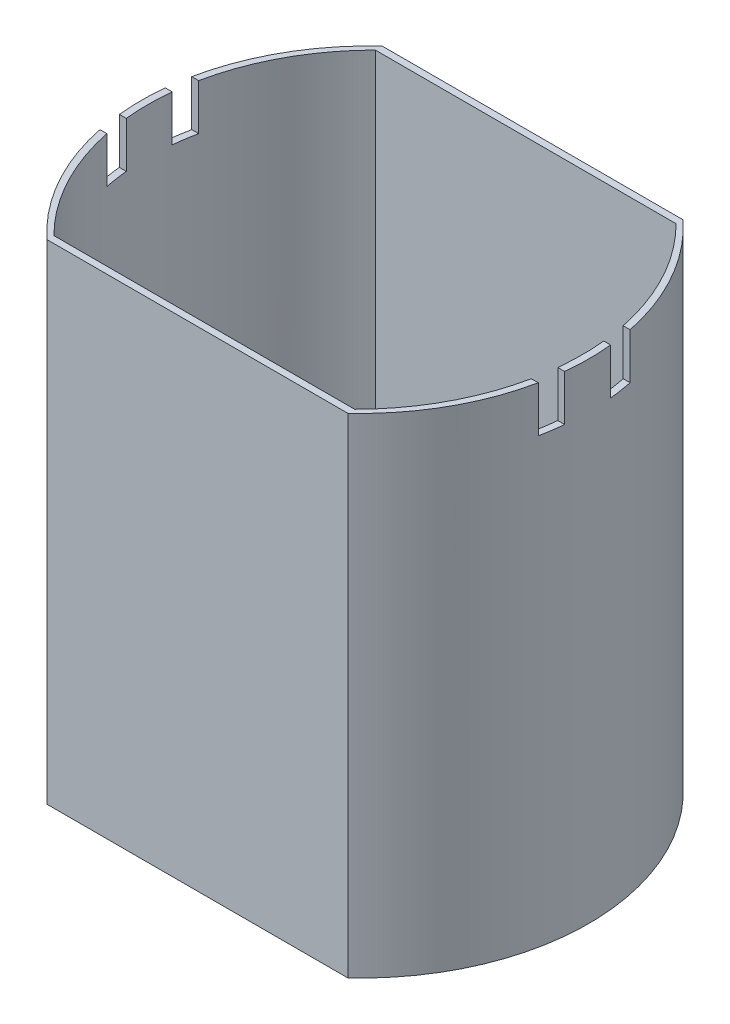
ISO-10303-21;
HEADER;
FILE_DESCRIPTION(('STEP AP214'),'2;1');
FILE_NAME('part.step','',(''),(''),'','','');
FILE_SCHEMA(('AUTOMOTIVE_DESIGN { 1 0 10303 214 1 1 1 1 }'));
ENDSEC;
DATA;
#1=APPLICATION_CONTEXT('core data for automotive mechanical design processes');
#2=APPLICATION_PROTOCOL_DEFINITION('international standard','automotive_design',2000,#1);
#3=PRODUCT_CONTEXT('',#1,'mechanical');
#4=PRODUCT('Part','Part','',(#3));
#5=PRODUCT_RELATED_PRODUCT_CATEGORY('part','',(#4));
#6=PRODUCT_DEFINITION_FORMATION('','',#4);
#7=PRODUCT_DEFINITION_CONTEXT('part definition',#1,'design');
#8=PRODUCT_DEFINITION('design','',#6,#7);
#9=PRODUCT_DEFINITION_SHAPE('','',#8);
#10=(LENGTH_UNIT() NAMED_UNIT(*) SI_UNIT(.MILLI.,.METRE.));
#11=(NAMED_UNIT(*) PLANE_ANGLE_UNIT() SI_UNIT($,.RADIAN.));
#12=(NAMED_UNIT(*) SI_UNIT($,.STERADIAN.) SOLID_ANGLE_UNIT());
#13=UNCERTAINTY_MEASURE_WITH_UNIT(LENGTH_MEASURE(1.E-05),#10,'distance_accuracy_value','');
#14=(GEOMETRIC_REPRESENTATION_CONTEXT(3) GLOBAL_UNCERTAINTY_ASSIGNED_CONTEXT((#13)) GLOBAL_UNIT_ASSIGNED_CONTEXT((#10,
#11,#12)) REPRESENTATION_CONTEXT('',''));
#15=CARTESIAN_POINT('',(0.,0.,0.));
#16=DIRECTION('',(0.,0.,1.));
#17=DIRECTION('',(1.,0.,0.));
#18=AXIS2_PLACEMENT_3D('',#15,#16,#17);
#19=CARTESIAN_POINT('',(-0.176562499999976,21.,0.));
#20=DIRECTION('',(0.,-1.,0.));
#21=DIRECTION('',(0.,0.,-1.));
#22=AXIS2_PLACEMENT_3D('',#19,#20,#21);
#23=PLANE('',#22);
#24=CARTESIAN_POINT('',(0.450000000000025,21.,0.));
#25=DIRECTION('',(0.,1.,0.));
#26=DIRECTION('',(0.,0.,1.));
#27=AXIS2_PLACEMENT_3D('',#24,#25,#26);
#28=CIRCLE('',#27,9.89949493661168);
#29=CARTESIAN_POINT('',(-9.3988578017961,21.,-0.999999999999998));
#30=VERTEX_POINT('',#29);
#31=CARTESIAN_POINT('',(-9.3988578017961,21.,1.));
#32=VERTEX_POINT('',#31);
#33=EDGE_CURVE('E233',#30,#32,#28,.T.);
#34=ORIENTED_EDGE('',*,*,#33,.F.);
#35=DIRECTION('',(1.,0.,0.));
#36=VECTOR('',#35,1.);
#37=CARTESIAN_POINT('',(-7.63118837493959,21.,-0.999999999999998));
#38=LINE('',#37,#36);
#39=CARTESIAN_POINT('',(-9.69950164855667,21.,-0.999999999999998));
#40=VERTEX_POINT('',#39);
#41=EDGE_CURVE('E347',#40,#30,#38,.T.);
#42=ORIENTED_EDGE('',*,*,#41,.F.);
#43=CARTESIAN_POINT('',(0.176562499999976,21.,0.));
#44=DIRECTION('',(0.,1.,0.));
#45=DIRECTION('',(0.,0.,1.));
#46=AXIS2_PLACEMENT_3D('',#43,#44,#45);
#47=CIRCLE('',#46,9.92656249999998);
#48=CARTESIAN_POINT('',(-9.69950164855667,21.,1.));
#49=VERTEX_POINT('',#48);
#50=EDGE_CURVE('E373',#40,#49,#47,.T.);
#51=ORIENTED_EDGE('',*,*,#50,.T.);
#52=DIRECTION('',(-1.,0.,0.));
#53=VECTOR('',#52,1.);
#54=CARTESIAN_POINT('',(-14.6311157832539,21.,1.));
#55=LINE('',#54,#53);
#56=EDGE_CURVE('E350',#32,#49,#55,.T.);
#57=ORIENTED_EDGE('',*,*,#56,.F.);
#58=EDGE_LOOP('',(#34,#42,#51,#57));
#59=FACE_BOUND('',#58,.T.);
#60=ADVANCED_FACE('F39',(#59),#23,.F.);
#61=CARTESIAN_POINT('',(-9.24535971483265,21.,2.));
#62=VERTEX_POINT('',#61);
#63=CARTESIAN_POINT('',(-6.55,21.,7.));
#64=VERTEX_POINT('',#63);
#65=EDGE_CURVE('E235',#62,#64,#28,.T.);
#66=ORIENTED_EDGE('',*,*,#65,.F.);
#67=DIRECTION('',(1.,0.,0.));
#68=VECTOR('',#67,1.);
#69=CARTESIAN_POINT('',(-7.53887561233951,21.,2.));
#70=LINE('',#69,#68);
#71=CARTESIAN_POINT('',(-9.54643308091057,21.,2.));
#72=VERTEX_POINT('',#71);
#73=EDGE_CURVE('E223',#72,#62,#70,.T.);
#74=ORIENTED_EDGE('',*,*,#73,.F.);
#75=CARTESIAN_POINT('',(-6.54999999999999,21.,7.3));
#76=VERTEX_POINT('',#75);
#77=EDGE_CURVE('E439',#72,#76,#47,.T.);
#78=ORIENTED_EDGE('',*,*,#77,.T.);
#79=DIRECTION('',(1.,0.,0.));
#80=VECTOR('',#79,1.);
#81=CARTESIAN_POINT('',(-6.54999999999999,21.,7.3));
#82=LINE('',#81,#80);
#83=CARTESIAN_POINT('',(6.54999999999999,21.,7.3));
#84=VERTEX_POINT('',#83);
#85=EDGE_CURVE('E430',#76,#84,#82,.T.);
#86=ORIENTED_EDGE('',*,*,#85,.T.);
#87=CARTESIAN_POINT('',(-0.176562499999976,21.,0.));
#88=DIRECTION('',(0.,1.,0.));
#89=DIRECTION('',(0.,0.,-1.));
#90=AXIS2_PLACEMENT_3D('',#87,#88,#89);
#91=CIRCLE('',#90,9.92656249999998);
#92=CARTESIAN_POINT('',(9.54643308091056,21.,2.));
#93=VERTEX_POINT('',#92);
#94=EDGE_CURVE('E425',#84,#93,#91,.T.);
#95=ORIENTED_EDGE('',*,*,#94,.T.);
#96=DIRECTION('',(1.,0.,0.));
#97=VECTOR('',#96,1.);
#98=CARTESIAN_POINT('',(7.53887561233951,21.,2.));
#99=LINE('',#98,#97);
#100=CARTESIAN_POINT('',(9.24535971483265,21.,2.));
#101=VERTEX_POINT('',#100);
#102=EDGE_CURVE('E324',#101,#93,#99,.T.);
#103=ORIENTED_EDGE('',*,*,#102,.F.);
#104=CARTESIAN_POINT('',(-0.450000000000025,21.,0.));
#105=DIRECTION('',(0.,1.,0.));
#106=DIRECTION('',(0.,0.,-1.));
#107=AXIS2_PLACEMENT_3D('',#104,#105,#106);
#108=CIRCLE('',#107,9.89949493661168);
#109=CARTESIAN_POINT('',(6.55,21.,7.));
#110=VERTEX_POINT('',#109);
#111=EDGE_CURVE('E249',#110,#101,#108,.T.);
#112=ORIENTED_EDGE('',*,*,#111,.F.);
#113=DIRECTION('',(1.,0.,0.));
#114=VECTOR('',#113,1.);
#115=CARTESIAN_POINT('',(-6.55,21.,7.));
#116=LINE('',#115,#114);
#117=EDGE_CURVE('E232',#64,#110,#116,.T.);
#118=ORIENTED_EDGE('',*,*,#117,.F.);
#119=EDGE_LOOP('',(#66,#74,#78,#86,#95,#103,#112,#118));
#120=FACE_BOUND('',#119,.T.);
#121=ADVANCED_FACE('F427',(#120),#23,.F.);
#122=CARTESIAN_POINT('',(-6.55,21.,-7.30000000000001));
#123=VERTEX_POINT('',#122);
#124=CARTESIAN_POINT('',(-9.54643308091057,21.,-2.));
#125=VERTEX_POINT('',#124);
#126=EDGE_CURVE('E221',#123,#125,#47,.T.);
#127=ORIENTED_EDGE('',*,*,#126,.T.);
#128=DIRECTION('',(-1.,0.,0.));
#129=VECTOR('',#128,1.);
#130=CARTESIAN_POINT('',(-15.3845657466614,21.,-2.));
#131=LINE('',#130,#129);
#132=CARTESIAN_POINT('',(-9.24535971483265,21.,-2.));
#133=VERTEX_POINT('',#132);
#134=EDGE_CURVE('E203',#133,#125,#131,.T.);
#135=ORIENTED_EDGE('',*,*,#134,.F.);
#136=CARTESIAN_POINT('',(-6.55,21.,-7.));
#137=VERTEX_POINT('',#136);
#138=EDGE_CURVE('E219',#137,#133,#28,.T.);
#139=ORIENTED_EDGE('',*,*,#138,.F.);
#140=DIRECTION('',(-1.,0.,0.));
#141=VECTOR('',#140,1.);
#142=CARTESIAN_POINT('',(-6.55,21.,-7.));
#143=LINE('',#142,#141);
#144=CARTESIAN_POINT('',(6.55,21.,-7.));
#145=VERTEX_POINT('',#144);
#146=EDGE_CURVE('E243',#145,#137,#143,.T.);
#147=ORIENTED_EDGE('',*,*,#146,.F.);
#148=CARTESIAN_POINT('',(9.24535971483265,21.,-2.));
#149=VERTEX_POINT('',#148);
#150=EDGE_CURVE('E256',#149,#145,#108,.T.);
#151=ORIENTED_EDGE('',*,*,#150,.F.);
#152=DIRECTION('',(-1.,0.,0.));
#153=VECTOR('',#152,1.);
#154=CARTESIAN_POINT('',(15.3845657466614,21.,-2.));
#155=LINE('',#154,#153);
#156=CARTESIAN_POINT('',(9.54643308091057,21.,-2.));
#157=VERTEX_POINT('',#156);
#158=EDGE_CURVE('E333',#157,#149,#155,.T.);
#159=ORIENTED_EDGE('',*,*,#158,.F.);
#160=CARTESIAN_POINT('',(6.55,21.,-7.3));
#161=VERTEX_POINT('',#160);
#162=EDGE_CURVE('E436',#157,#161,#91,.T.);
#163=ORIENTED_EDGE('',*,*,#162,.T.);
#164=DIRECTION('',(-1.,0.,0.));
#165=VECTOR('',#164,1.);
#166=CARTESIAN_POINT('',(-6.55,21.,-7.30000000000001));
#167=LINE('',#166,#165);
#168=EDGE_CURVE('E433',#161,#123,#167,.T.);
#169=ORIENTED_EDGE('',*,*,#168,.T.);
#170=EDGE_LOOP('',(#127,#135,#139,#147,#151,#159,#163,#169));
#171=FACE_BOUND('',#170,.T.);
#172=ADVANCED_FACE('F217',(#171),#23,.F.);
#173=CARTESIAN_POINT('',(9.3988578017961,21.,1.));
#174=VERTEX_POINT('',#173);
#175=CARTESIAN_POINT('',(9.3988578017961,21.,-0.999999999999998));
#176=VERTEX_POINT('',#175);
#177=EDGE_CURVE('E254',#174,#176,#108,.T.);
#178=ORIENTED_EDGE('',*,*,#177,.F.);
#179=DIRECTION('',(-1.,0.,0.));
#180=VECTOR('',#179,1.);
#181=CARTESIAN_POINT('',(14.6311157832539,21.,1.));
#182=LINE('',#181,#180);
#183=CARTESIAN_POINT('',(9.69950164855667,21.,1.));
#184=VERTEX_POINT('',#183);
#185=EDGE_CURVE('E327',#184,#174,#182,.T.);
#186=ORIENTED_EDGE('',*,*,#185,.F.);
#187=CARTESIAN_POINT('',(9.69950164855667,21.,-0.999999999999998));
#188=VERTEX_POINT('',#187);
#189=EDGE_CURVE('E434',#184,#188,#91,.T.);
#190=ORIENTED_EDGE('',*,*,#189,.T.);
#191=DIRECTION('',(1.,0.,0.));
#192=VECTOR('',#191,1.);
#193=CARTESIAN_POINT('',(7.63118837493959,21.,-0.999999999999998));
#194=LINE('',#193,#192);
#195=EDGE_CURVE('E330',#176,#188,#194,.T.);
#196=ORIENTED_EDGE('',*,*,#195,.F.);
#197=EDGE_LOOP('',(#178,#186,#190,#196));
#198=FACE_BOUND('',#197,.T.);
#199=ADVANCED_FACE('F525',(#198),#23,.F.);
#200=CARTESIAN_POINT('',(-0.176562499999976,21.,0.));
#201=DIRECTION('',(0.,-1.,0.));
#202=DIRECTION('',(0.,0.,-1.));
#203=AXIS2_PLACEMENT_3D('',#200,#201,#202);
#204=CYLINDRICAL_SURFACE('',#203,9.92656249999998);
#205=CARTESIAN_POINT('',(-0.176562499999976,19.,0.));
#206=DIRECTION('',(0.,1.,0.));
#207=DIRECTION('',(0.,0.,1.));
#208=AXIS2_PLACEMENT_3D('',#205,#206,#207);
#209=CIRCLE('',#208,9.92656249999998);
#210=CARTESIAN_POINT('',(9.54643308091056,19.,2.));
#211=VERTEX_POINT('',#210);
#212=CARTESIAN_POINT('',(9.69950164855667,19.,1.));
#213=VERTEX_POINT('',#212);
#214=EDGE_CURVE('E299',#211,#213,#209,.T.);
#215=ORIENTED_EDGE('',*,*,#214,.F.);
#216=DIRECTION('',(0.,-1.,0.));
#217=VECTOR('',#216,1.);
#218=CARTESIAN_POINT('',(9.54643308091056,21.,2.));
#219=LINE('',#218,#217);
#220=EDGE_CURVE('E287',#211,#93,#219,.F.);
#221=ORIENTED_EDGE('',*,*,#220,.T.);
#222=ORIENTED_EDGE('',*,*,#94,.F.);
#223=DIRECTION('',(0.,-1.,0.));
#224=VECTOR('',#223,1.);
#225=CARTESIAN_POINT('',(6.54999999999999,21.,7.3));
#226=LINE('',#225,#224);
#227=CARTESIAN_POINT('',(6.54999999999999,-0.3,7.3));
#228=VERTEX_POINT('',#227);
#229=EDGE_CURVE('E490',#84,#228,#226,.T.);
#230=ORIENTED_EDGE('',*,*,#229,.T.);
#231=CARTESIAN_POINT('',(-0.176562499999981,-0.3,0.));
#232=DIRECTION('',(0.,1.,0.));
#233=DIRECTION('',(0.,0.,-1.));
#234=AXIS2_PLACEMENT_3D('',#231,#232,#233);
#235=CIRCLE('',#234,9.92656249999999);
#236=CARTESIAN_POINT('',(6.55,-0.3,-7.3));
#237=VERTEX_POINT('',#236);
#238=EDGE_CURVE('E271',#228,#237,#235,.T.);
#239=ORIENTED_EDGE('',*,*,#238,.T.);
#240=DIRECTION('',(0.,-1.,0.));
#241=VECTOR('',#240,1.);
#242=CARTESIAN_POINT('',(6.55,21.,-7.3));
#243=LINE('',#242,#241);
#244=EDGE_CURVE('E499',#161,#237,#243,.T.);
#245=ORIENTED_EDGE('',*,*,#244,.F.);
#246=ORIENTED_EDGE('',*,*,#162,.F.);
#247=DIRECTION('',(0.,-1.,0.));
#248=VECTOR('',#247,1.);
#249=CARTESIAN_POINT('',(9.54643308091056,21.,-2.));
#250=LINE('',#249,#248);
#251=CARTESIAN_POINT('',(9.54643308091057,19.,-2.));
#252=VERTEX_POINT('',#251);
#253=EDGE_CURVE('E280',#157,#252,#250,.T.);
#254=ORIENTED_EDGE('',*,*,#253,.T.);
#255=CARTESIAN_POINT('',(9.69950164855667,19.,-0.999999999999998));
#256=VERTEX_POINT('',#255);
#257=EDGE_CURVE('E300',#256,#252,#209,.T.);
#258=ORIENTED_EDGE('',*,*,#257,.F.);
#259=DIRECTION('',(0.,-1.,0.));
#260=VECTOR('',#259,1.);
#261=CARTESIAN_POINT('',(9.69950164855667,21.,-0.999999999999998));
#262=LINE('',#261,#260);
#263=EDGE_CURVE('E295',#256,#188,#262,.F.);
#264=ORIENTED_EDGE('',*,*,#263,.T.);
#265=ORIENTED_EDGE('',*,*,#189,.F.);
#266=DIRECTION('',(0.,-1.,0.));
#267=VECTOR('',#266,1.);
#268=CARTESIAN_POINT('',(9.69950164855667,21.,1.));
#269=LINE('',#268,#267);
#270=EDGE_CURVE('E291',#184,#213,#269,.T.);
#271=ORIENTED_EDGE('',*,*,#270,.T.);
#272=EDGE_LOOP('',(#215,#221,#222,#230,#239,#245,#246,#254,#258,#264,#265,#271));
#273=FACE_BOUND('',#272,.T.);
#274=ADVANCED_FACE('F41',(#273),#204,.T.);
#275=CARTESIAN_POINT('',(-6.55,21.,-7.30000000000001));
#276=DIRECTION('',(0.,0.,1.));
#277=DIRECTION('',(1.,0.,0.));
#278=AXIS2_PLACEMENT_3D('',#275,#276,#277);
#279=PLANE('',#278);
#280=ORIENTED_EDGE('',*,*,#244,.T.);
#281=DIRECTION('',(-1.,0.,0.));
#282=VECTOR('',#281,1.);
#283=CARTESIAN_POINT('',(-6.55,-0.3,-7.30000000000001));
#284=LINE('',#283,#282);
#285=CARTESIAN_POINT('',(-6.55,-0.3,-7.30000000000001));
#286=VERTEX_POINT('',#285);
#287=EDGE_CURVE('E267',#237,#286,#284,.T.);
#288=ORIENTED_EDGE('',*,*,#287,.T.);
#289=DIRECTION('',(0.,-1.,0.));
#290=VECTOR('',#289,1.);
#291=CARTESIAN_POINT('',(-6.55,21.,-7.30000000000001));
#292=LINE('',#291,#290);
#293=EDGE_CURVE('E496',#123,#286,#292,.T.);
#294=ORIENTED_EDGE('',*,*,#293,.F.);
#295=ORIENTED_EDGE('',*,*,#168,.F.);
#296=EDGE_LOOP('',(#280,#288,#294,#295));
#297=FACE_BOUND('',#296,.T.);
#298=ADVANCED_FACE('F505',(#297),#279,.F.);
#299=CARTESIAN_POINT('',(0.176562499999976,21.,0.));
#300=DIRECTION('',(0.,-1.,0.));
#301=DIRECTION('',(0.,0.,-1.));
#302=AXIS2_PLACEMENT_3D('',#299,#300,#301);
#303=CYLINDRICAL_SURFACE('',#302,9.92656249999998);
#304=CARTESIAN_POINT('',(0.176562499999976,19.,0.));
#305=DIRECTION('',(0.,-1.,0.));
#306=DIRECTION('',(0.,0.,-1.));
#307=AXIS2_PLACEMENT_3D('',#304,#305,#306);
#308=CIRCLE('',#307,9.92656249999998);
#309=CARTESIAN_POINT('',(-9.54643308091057,19.,2.));
#310=VERTEX_POINT('',#309);
#311=CARTESIAN_POINT('',(-9.69950164855667,19.,1.));
#312=VERTEX_POINT('',#311);
#313=EDGE_CURVE('E318',#310,#312,#308,.T.);
#314=ORIENTED_EDGE('',*,*,#313,.T.);
#315=DIRECTION('',(0.,-1.,0.));
#316=VECTOR('',#315,1.);
#317=CARTESIAN_POINT('',(-9.69950164855667,21.,1.));
#318=LINE('',#317,#316);
#319=EDGE_CURVE('E307',#312,#49,#318,.F.);
#320=ORIENTED_EDGE('',*,*,#319,.T.);
#321=ORIENTED_EDGE('',*,*,#50,.F.);
#322=DIRECTION('',(0.,-1.,0.));
#323=VECTOR('',#322,1.);
#324=CARTESIAN_POINT('',(-9.69950164855667,21.,-0.999999999999998));
#325=LINE('',#324,#323);
#326=CARTESIAN_POINT('',(-9.69950164855667,19.,-0.999999999999998));
#327=VERTEX_POINT('',#326);
#328=EDGE_CURVE('E303',#40,#327,#325,.T.);
#329=ORIENTED_EDGE('',*,*,#328,.T.);
#330=CARTESIAN_POINT('',(-9.54643308091057,19.,-2.));
#331=VERTEX_POINT('',#330);
#332=EDGE_CURVE('E319',#327,#331,#308,.T.);
#333=ORIENTED_EDGE('',*,*,#332,.T.);
#334=DIRECTION('',(0.,-1.,0.));
#335=VECTOR('',#334,1.);
#336=CARTESIAN_POINT('',(-9.54643308091057,21.,-2.));
#337=LINE('',#336,#335);
#338=EDGE_CURVE('E315',#331,#125,#337,.F.);
#339=ORIENTED_EDGE('',*,*,#338,.T.);
#340=ORIENTED_EDGE('',*,*,#126,.F.);
#341=ORIENTED_EDGE('',*,*,#293,.T.);
#342=CARTESIAN_POINT('',(0.176562499999983,-0.3,0.));
#343=DIRECTION('',(0.,1.,0.));
#344=DIRECTION('',(0.,0.,1.));
#345=AXIS2_PLACEMENT_3D('',#342,#343,#344);
#346=CIRCLE('',#345,9.92656249999998);
#347=CARTESIAN_POINT('',(-6.54999999999999,-0.3,7.29999999999998));
#348=VERTEX_POINT('',#347);
#349=EDGE_CURVE('E263',#286,#348,#346,.T.);
#350=ORIENTED_EDGE('',*,*,#349,.T.);
#351=DIRECTION('',(0.,-1.,0.));
#352=VECTOR('',#351,1.);
#353=CARTESIAN_POINT('',(-6.54999999999999,21.,7.3));
#354=LINE('',#353,#352);
#355=EDGE_CURVE('E483',#76,#348,#354,.T.);
#356=ORIENTED_EDGE('',*,*,#355,.F.);
#357=ORIENTED_EDGE('',*,*,#77,.F.);
#358=DIRECTION('',(0.,-1.,0.));
#359=VECTOR('',#358,1.);
#360=CARTESIAN_POINT('',(-9.54643308091056,21.,2.));
#361=LINE('',#360,#359);
#362=EDGE_CURVE('E311',#72,#310,#361,.T.);
#363=ORIENTED_EDGE('',*,*,#362,.T.);
#364=EDGE_LOOP('',(#314,#320,#321,#329,#333,#339,#340,#341,#350,#356,#357,#363));
#365=FACE_BOUND('',#364,.T.);
#366=ADVANCED_FACE('F370',(#365),#303,.T.);
#367=CARTESIAN_POINT('',(-6.54999999999999,21.,7.3));
#368=DIRECTION('',(0.,0.,-1.));
#369=DIRECTION('',(-1.,0.,0.));
#370=AXIS2_PLACEMENT_3D('',#367,#368,#369);
#371=PLANE('',#370);
#372=ORIENTED_EDGE('',*,*,#355,.T.);
#373=DIRECTION('',(1.,0.,0.));
#374=VECTOR('',#373,1.);
#375=CARTESIAN_POINT('',(-6.54999999999999,-0.3,7.29999999999999));
#376=LINE('',#375,#374);
#377=EDGE_CURVE('E258',#348,#228,#376,.T.);
#378=ORIENTED_EDGE('',*,*,#377,.T.);
#379=ORIENTED_EDGE('',*,*,#229,.F.);
#380=ORIENTED_EDGE('',*,*,#85,.F.);
#381=EDGE_LOOP('',(#372,#378,#379,#380));
#382=FACE_BOUND('',#381,.T.);
#383=ADVANCED_FACE('F513',(#382),#371,.F.);
#384=CARTESIAN_POINT('',(-0.450000000000025,21.,0.));
#385=DIRECTION('',(0.,-1.,0.));
#386=DIRECTION('',(0.,0.,-1.));
#387=AXIS2_PLACEMENT_3D('',#384,#385,#386);
#388=CYLINDRICAL_SURFACE('',#387,9.89949493661168);
#389=DIRECTION('',(0.,-1.,0.));
#390=VECTOR('',#389,1.);
#391=CARTESIAN_POINT('',(9.24535971483265,21.,2.));
#392=LINE('',#391,#390);
#393=CARTESIAN_POINT('',(9.24535971483265,19.,2.));
#394=VERTEX_POINT('',#393);
#395=EDGE_CURVE('E11',#394,#101,#392,.F.);
#396=ORIENTED_EDGE('',*,*,#395,.F.);
#397=CARTESIAN_POINT('',(-0.450000000000025,19.,0.));
#398=DIRECTION('',(0.,1.,0.));
#399=DIRECTION('',(0.,0.,1.));
#400=AXIS2_PLACEMENT_3D('',#397,#398,#399);
#401=CIRCLE('',#400,9.89949493661168);
#402=CARTESIAN_POINT('',(9.3988578017961,19.,1.));
#403=VERTEX_POINT('',#402);
#404=EDGE_CURVE('E401',#394,#403,#401,.T.);
#405=ORIENTED_EDGE('',*,*,#404,.T.);
#406=DIRECTION('',(0.,-1.,0.));
#407=VECTOR('',#406,1.);
#408=CARTESIAN_POINT('',(9.39885780179609,21.,1.));
#409=LINE('',#408,#407);
#410=EDGE_CURVE('E48',#174,#403,#409,.T.);
#411=ORIENTED_EDGE('',*,*,#410,.F.);
#412=ORIENTED_EDGE('',*,*,#177,.T.);
#413=DIRECTION('',(0.,-1.,0.));
#414=VECTOR('',#413,1.);
#415=CARTESIAN_POINT('',(9.39885780179609,21.,-0.999999999999998));
#416=LINE('',#415,#414);
#417=CARTESIAN_POINT('',(9.3988578017961,19.,-0.999999999999998));
#418=VERTEX_POINT('',#417);
#419=EDGE_CURVE('E400',#418,#176,#416,.F.);
#420=ORIENTED_EDGE('',*,*,#419,.F.);
#421=CARTESIAN_POINT('',(9.24535971483265,19.,-2.));
#422=VERTEX_POINT('',#421);
#423=EDGE_CURVE('E396',#418,#422,#401,.T.);
#424=ORIENTED_EDGE('',*,*,#423,.T.);
#425=DIRECTION('',(0.,-1.,0.));
#426=VECTOR('',#425,1.);
#427=CARTESIAN_POINT('',(9.24535971483265,21.,-2.));
#428=LINE('',#427,#426);
#429=EDGE_CURVE('E404',#149,#422,#428,.T.);
#430=ORIENTED_EDGE('',*,*,#429,.F.);
#431=ORIENTED_EDGE('',*,*,#150,.T.);
#432=DIRECTION('',(0.,-1.,0.));
#433=VECTOR('',#432,1.);
#434=CARTESIAN_POINT('',(6.55,21.,-7.));
#435=LINE('',#434,#433);
#436=CARTESIAN_POINT('',(6.55,0.,-7.));
#437=VERTEX_POINT('',#436);
#438=EDGE_CURVE('E444',#145,#437,#435,.T.);
#439=ORIENTED_EDGE('',*,*,#438,.T.);
#440=CARTESIAN_POINT('',(-0.450000000000025,0.,0.));
#441=DIRECTION('',(0.,1.,0.));
#442=DIRECTION('',(0.,0.,-1.));
#443=AXIS2_PLACEMENT_3D('',#440,#441,#442);
#444=CIRCLE('',#443,9.89949493661168);
#445=CARTESIAN_POINT('',(6.55,0.,7.));
#446=VERTEX_POINT('',#445);
#447=EDGE_CURVE('E262',#446,#437,#444,.T.);
#448=ORIENTED_EDGE('',*,*,#447,.F.);
#449=DIRECTION('',(0.,-1.,0.));
#450=VECTOR('',#449,1.);
#451=CARTESIAN_POINT('',(6.55,21.,7.));
#452=LINE('',#451,#450);
#453=EDGE_CURVE('E238',#110,#446,#452,.T.);
#454=ORIENTED_EDGE('',*,*,#453,.F.);
#455=ORIENTED_EDGE('',*,*,#111,.T.);
#456=EDGE_LOOP('',(#396,#405,#411,#412,#420,#424,#430,#431,#439,#448,#454,#455));
#457=FACE_BOUND('',#456,.T.);
#458=ADVANCED_FACE('F413',(#457),#388,.F.);
#459=CARTESIAN_POINT('',(-6.55,21.,-7.));
#460=DIRECTION('',(0.,0.,1.));
#461=DIRECTION('',(1.,0.,0.));
#462=AXIS2_PLACEMENT_3D('',#459,#460,#461);
#463=PLANE('',#462);
#464=DIRECTION('',(-1.,0.,0.));
#465=VECTOR('',#464,1.);
#466=CARTESIAN_POINT('',(-6.55,0.,-7.));
#467=LINE('',#466,#465);
#468=CARTESIAN_POINT('',(-6.55,0.,-7.));
#469=VERTEX_POINT('',#468);
#470=EDGE_CURVE('E468',#437,#469,#467,.T.);
#471=ORIENTED_EDGE('',*,*,#470,.F.);
#472=ORIENTED_EDGE('',*,*,#438,.F.);
#473=ORIENTED_EDGE('',*,*,#146,.T.);
#474=DIRECTION('',(0.,-1.,0.));
#475=VECTOR('',#474,1.);
#476=CARTESIAN_POINT('',(-6.55,21.,-7.));
#477=LINE('',#476,#475);
#478=EDGE_CURVE('E230',#137,#469,#477,.T.);
#479=ORIENTED_EDGE('',*,*,#478,.T.);
#480=EDGE_LOOP('',(#471,#472,#473,#479));
#481=FACE_BOUND('',#480,.T.);
#482=ADVANCED_FACE('F520',(#481),#463,.T.);
#483=CARTESIAN_POINT('',(0.450000000000025,21.,0.));
#484=DIRECTION('',(0.,-1.,0.));
#485=DIRECTION('',(0.,0.,-1.));
#486=AXIS2_PLACEMENT_3D('',#483,#484,#485);
#487=CYLINDRICAL_SURFACE('',#486,9.89949493661168);
#488=DIRECTION('',(0.,-1.,0.));
#489=VECTOR('',#488,1.);
#490=CARTESIAN_POINT('',(-9.39885780179609,21.,1.));
#491=LINE('',#490,#489);
#492=CARTESIAN_POINT('',(-9.3988578017961,19.,1.));
#493=VERTEX_POINT('',#492);
#494=EDGE_CURVE('E383',#493,#32,#491,.F.);
#495=ORIENTED_EDGE('',*,*,#494,.F.);
#496=CARTESIAN_POINT('',(0.450000000000025,19.,0.));
#497=DIRECTION('',(0.,-1.,0.));
#498=DIRECTION('',(0.,0.,-1.));
#499=AXIS2_PLACEMENT_3D('',#496,#497,#498);
#500=CIRCLE('',#499,9.89949493661168);
#501=CARTESIAN_POINT('',(-9.24535971483265,19.,2.));
#502=VERTEX_POINT('',#501);
#503=EDGE_CURVE('E385',#502,#493,#500,.T.);
#504=ORIENTED_EDGE('',*,*,#503,.F.);
#505=DIRECTION('',(0.,-1.,0.));
#506=VECTOR('',#505,1.);
#507=CARTESIAN_POINT('',(-9.24535971483265,21.,2.));
#508=LINE('',#507,#506);
#509=EDGE_CURVE('E388',#62,#502,#508,.T.);
#510=ORIENTED_EDGE('',*,*,#509,.F.);
#511=ORIENTED_EDGE('',*,*,#65,.T.);
#512=DIRECTION('',(0.,-1.,0.));
#513=VECTOR('',#512,1.);
#514=CARTESIAN_POINT('',(-6.55,21.,7.));
#515=LINE('',#514,#513);
#516=CARTESIAN_POINT('',(-6.55,0.,7.));
#517=VERTEX_POINT('',#516);
#518=EDGE_CURVE('E452',#64,#517,#515,.T.);
#519=ORIENTED_EDGE('',*,*,#518,.T.);
#520=CARTESIAN_POINT('',(0.450000000000025,0.,0.));
#521=DIRECTION('',(0.,1.,0.));
#522=DIRECTION('',(0.,0.,1.));
#523=AXIS2_PLACEMENT_3D('',#520,#521,#522);
#524=CIRCLE('',#523,9.89949493661168);
#525=EDGE_CURVE('E464',#469,#517,#524,.T.);
#526=ORIENTED_EDGE('',*,*,#525,.F.);
#527=ORIENTED_EDGE('',*,*,#478,.F.);
#528=ORIENTED_EDGE('',*,*,#138,.T.);
#529=DIRECTION('',(0.,-1.,0.));
#530=VECTOR('',#529,1.);
#531=CARTESIAN_POINT('',(-9.24535971483265,21.,-2.));
#532=LINE('',#531,#530);
#533=CARTESIAN_POINT('',(-9.24535971483265,19.,-2.));
#534=VERTEX_POINT('',#533);
#535=EDGE_CURVE('E200',#534,#133,#532,.F.);
#536=ORIENTED_EDGE('',*,*,#535,.F.);
#537=CARTESIAN_POINT('',(-9.3988578017961,19.,-0.999999999999998));
#538=VERTEX_POINT('',#537);
#539=EDGE_CURVE('E212',#538,#534,#500,.T.);
#540=ORIENTED_EDGE('',*,*,#539,.F.);
#541=DIRECTION('',(0.,-1.,0.));
#542=VECTOR('',#541,1.);
#543=CARTESIAN_POINT('',(-9.39885780179609,21.,-0.999999999999998));
#544=LINE('',#543,#542);
#545=EDGE_CURVE('E211',#30,#538,#544,.T.);
#546=ORIENTED_EDGE('',*,*,#545,.F.);
#547=ORIENTED_EDGE('',*,*,#33,.T.);
#548=EDGE_LOOP('',(#495,#504,#510,#511,#519,#526,#527,#528,#536,#540,#546,#547));
#549=FACE_BOUND('',#548,.T.);
#550=ADVANCED_FACE('F228',(#549),#487,.F.);
#551=CARTESIAN_POINT('',(-6.55,21.,7.));
#552=DIRECTION('',(0.,0.,-1.));
#553=DIRECTION('',(-1.,0.,0.));
#554=AXIS2_PLACEMENT_3D('',#551,#552,#553);
#555=PLANE('',#554);
#556=DIRECTION('',(1.,0.,0.));
#557=VECTOR('',#556,1.);
#558=CARTESIAN_POINT('',(-6.55,0.,7.));
#559=LINE('',#558,#557);
#560=EDGE_CURVE('E460',#517,#446,#559,.T.);
#561=ORIENTED_EDGE('',*,*,#560,.F.);
#562=ORIENTED_EDGE('',*,*,#518,.F.);
#563=ORIENTED_EDGE('',*,*,#117,.T.);
#564=ORIENTED_EDGE('',*,*,#453,.T.);
#565=EDGE_LOOP('',(#561,#562,#563,#564));
#566=FACE_BOUND('',#565,.T.);
#567=ADVANCED_FACE('F477',(#566),#555,.T.);
#568=CARTESIAN_POINT('',(-0.176562499999981,0.,0.));
#569=DIRECTION('',(0.,-1.,0.));
#570=DIRECTION('',(0.,0.,-1.));
#571=AXIS2_PLACEMENT_3D('',#568,#569,#570);
#572=PLANE('',#571);
#573=CARTESIAN_POINT('',(0.,0.,0.));
#574=DIRECTION('',(0.,1.,0.));
#575=DIRECTION('',(0.,0.,1.));
#576=AXIS2_PLACEMENT_3D('',#573,#574,#575);
#577=CIRCLE('',#576,0.9);
#578=CARTESIAN_POINT('',(0.,0.,0.9));
#579=VERTEX_POINT('',#578);
#580=EDGE_CURVE('E276',#579,#579,#577,.T.);
#581=ORIENTED_EDGE('',*,*,#580,.F.);
#582=EDGE_LOOP('',(#581));
#583=FACE_BOUND('',#582,.T.);
#584=ORIENTED_EDGE('',*,*,#525,.T.);
#585=ORIENTED_EDGE('',*,*,#560,.T.);
#586=ORIENTED_EDGE('',*,*,#447,.T.);
#587=ORIENTED_EDGE('',*,*,#470,.T.);
#588=EDGE_LOOP('',(#584,#585,#586,#587));
#589=FACE_BOUND('',#588,.T.);
#590=ADVANCED_FACE('F474',(#583,#589),#572,.F.);
#591=CARTESIAN_POINT('',(-0.176562499999981,-0.3,0.));
#592=DIRECTION('',(0.,-1.,0.));
#593=DIRECTION('',(0.,0.,-1.));
#594=AXIS2_PLACEMENT_3D('',#591,#592,#593);
#595=PLANE('',#594);
#596=CARTESIAN_POINT('',(0.,-0.3,0.));
#597=DIRECTION('',(0.,1.,0.));
#598=DIRECTION('',(0.,0.,1.));
#599=AXIS2_PLACEMENT_3D('',#596,#597,#598);
#600=CIRCLE('',#599,0.9);
#601=CARTESIAN_POINT('',(0.,-0.3,0.9));
#602=VERTEX_POINT('',#601);
#603=EDGE_CURVE('E275',#602,#602,#600,.T.);
#604=ORIENTED_EDGE('',*,*,#603,.T.);
#605=EDGE_LOOP('',(#604));
#606=FACE_BOUND('',#605,.T.);
#607=ORIENTED_EDGE('',*,*,#238,.F.);
#608=ORIENTED_EDGE('',*,*,#377,.F.);
#609=ORIENTED_EDGE('',*,*,#349,.F.);
#610=ORIENTED_EDGE('',*,*,#287,.F.);
#611=EDGE_LOOP('',(#607,#608,#609,#610));
#612=FACE_BOUND('',#611,.T.);
#613=ADVANCED_FACE('F510',(#606,#612),#595,.T.);
#614=CARTESIAN_POINT('',(0.,-0.3,0.));
#615=DIRECTION('',(0.,1.,0.));
#616=DIRECTION('',(0.,0.,1.));
#617=AXIS2_PLACEMENT_3D('',#614,#615,#616);
#618=CYLINDRICAL_SURFACE('',#617,0.9);
#619=ORIENTED_EDGE('',*,*,#603,.F.);
#620=EDGE_LOOP('',(#619));
#621=FACE_BOUND('',#620,.T.);
#622=ORIENTED_EDGE('',*,*,#580,.T.);
#623=EDGE_LOOP('',(#622));
#624=FACE_BOUND('',#623,.T.);
#625=ADVANCED_FACE('F557',(#621,#624),#618,.F.);
#626=CARTESIAN_POINT('',(0.,19.,0.));
#627=DIRECTION('',(0.,-1.,0.));
#628=DIRECTION('',(0.,0.,-1.));
#629=AXIS2_PLACEMENT_3D('',#626,#627,#628);
#630=PLANE('',#629);
#631=DIRECTION('',(1.,0.,0.));
#632=VECTOR('',#631,1.);
#633=CARTESIAN_POINT('',(-7.63118837493959,19.,-0.999999999999998));
#634=LINE('',#633,#632);
#635=EDGE_CURVE('E323',#327,#538,#634,.T.);
#636=ORIENTED_EDGE('',*,*,#635,.T.);
#637=ORIENTED_EDGE('',*,*,#539,.T.);
#638=DIRECTION('',(-1.,0.,0.));
#639=VECTOR('',#638,1.);
#640=CARTESIAN_POINT('',(-15.3845657466614,19.,-2.));
#641=LINE('',#640,#639);
#642=EDGE_CURVE('E206',#534,#331,#641,.T.);
#643=ORIENTED_EDGE('',*,*,#642,.T.);
#644=ORIENTED_EDGE('',*,*,#332,.F.);
#645=EDGE_LOOP('',(#636,#637,#643,#644));
#646=FACE_BOUND('',#645,.T.);
#647=ADVANCED_FACE('F366',(#646),#630,.F.);
#648=CARTESIAN_POINT('',(-15.3845657466614,19.,-2.));
#649=DIRECTION('',(0.,0.,-1.));
#650=DIRECTION('',(-1.,0.,0.));
#651=AXIS2_PLACEMENT_3D('',#648,#649,#650);
#652=PLANE('',#651);
#653=ORIENTED_EDGE('',*,*,#642,.F.);
#654=ORIENTED_EDGE('',*,*,#535,.T.);
#655=ORIENTED_EDGE('',*,*,#134,.T.);
#656=ORIENTED_EDGE('',*,*,#338,.F.);
#657=EDGE_LOOP('',(#653,#654,#655,#656));
#658=FACE_BOUND('',#657,.T.);
#659=ADVANCED_FACE('F202',(#658),#652,.F.);
#660=CARTESIAN_POINT('',(-7.63118837493959,19.,-0.999999999999998));
#661=DIRECTION('',(0.,0.,1.));
#662=DIRECTION('',(1.,0.,0.));
#663=AXIS2_PLACEMENT_3D('',#660,#661,#662);
#664=PLANE('',#663);
#665=ORIENTED_EDGE('',*,*,#41,.T.);
#666=ORIENTED_EDGE('',*,*,#545,.T.);
#667=ORIENTED_EDGE('',*,*,#635,.F.);
#668=ORIENTED_EDGE('',*,*,#328,.F.);
#669=EDGE_LOOP('',(#665,#666,#667,#668));
#670=FACE_BOUND('',#669,.T.);
#671=ADVANCED_FACE('F376',(#670),#664,.F.);
#672=CARTESIAN_POINT('',(-14.6311157832539,19.,1.));
#673=DIRECTION('',(0.,0.,-1.));
#674=DIRECTION('',(-1.,0.,0.));
#675=AXIS2_PLACEMENT_3D('',#672,#673,#674);
#676=PLANE('',#675);
#677=DIRECTION('',(-1.,0.,0.));
#678=VECTOR('',#677,1.);
#679=CARTESIAN_POINT('',(-14.6311157832539,19.,1.));
#680=LINE('',#679,#678);
#681=EDGE_CURVE('E357',#493,#312,#680,.T.);
#682=ORIENTED_EDGE('',*,*,#681,.F.);
#683=ORIENTED_EDGE('',*,*,#494,.T.);
#684=ORIENTED_EDGE('',*,*,#56,.T.);
#685=ORIENTED_EDGE('',*,*,#319,.F.);
#686=EDGE_LOOP('',(#682,#683,#684,#685));
#687=FACE_BOUND('',#686,.T.);
#688=ADVANCED_FACE('F584',(#687),#676,.F.);
#689=CARTESIAN_POINT('',(-7.53887561233951,19.,2.));
#690=DIRECTION('',(0.,0.,1.));
#691=DIRECTION('',(1.,0.,0.));
#692=AXIS2_PLACEMENT_3D('',#689,#690,#691);
#693=PLANE('',#692);
#694=ORIENTED_EDGE('',*,*,#73,.T.);
#695=ORIENTED_EDGE('',*,*,#509,.T.);
#696=DIRECTION('',(1.,0.,0.));
#697=VECTOR('',#696,1.);
#698=CARTESIAN_POINT('',(-7.53887561233951,19.,2.));
#699=LINE('',#698,#697);
#700=EDGE_CURVE('E361',#310,#502,#699,.T.);
#701=ORIENTED_EDGE('',*,*,#700,.F.);
#702=ORIENTED_EDGE('',*,*,#362,.F.);
#703=EDGE_LOOP('',(#694,#695,#701,#702));
#704=FACE_BOUND('',#703,.T.);
#705=ADVANCED_FACE('F580',(#704),#693,.F.);
#706=ORIENTED_EDGE('',*,*,#700,.T.);
#707=ORIENTED_EDGE('',*,*,#503,.T.);
#708=ORIENTED_EDGE('',*,*,#681,.T.);
#709=ORIENTED_EDGE('',*,*,#313,.F.);
#710=EDGE_LOOP('',(#706,#707,#708,#709));
#711=FACE_BOUND('',#710,.T.);
#712=ADVANCED_FACE('F583',(#711),#630,.F.);
#713=CARTESIAN_POINT('',(0.,19.,0.));
#714=DIRECTION('',(0.,1.,0.));
#715=DIRECTION('',(0.,0.,1.));
#716=AXIS2_PLACEMENT_3D('',#713,#714,#715);
#717=PLANE('',#716);
#718=ORIENTED_EDGE('',*,*,#257,.T.);
#719=DIRECTION('',(-1.,0.,0.));
#720=VECTOR('',#719,1.);
#721=CARTESIAN_POINT('',(15.3845657466614,19.,-2.));
#722=LINE('',#721,#720);
#723=EDGE_CURVE('E63',#252,#422,#722,.T.);
#724=ORIENTED_EDGE('',*,*,#723,.T.);
#725=ORIENTED_EDGE('',*,*,#423,.F.);
#726=DIRECTION('',(1.,0.,0.));
#727=VECTOR('',#726,1.);
#728=CARTESIAN_POINT('',(7.63118837493959,19.,-0.999999999999998));
#729=LINE('',#728,#727);
#730=EDGE_CURVE('E341',#418,#256,#729,.T.);
#731=ORIENTED_EDGE('',*,*,#730,.T.);
#732=EDGE_LOOP('',(#718,#724,#725,#731));
#733=FACE_BOUND('',#732,.T.);
#734=ADVANCED_FACE('F569',(#733),#717,.T.);
#735=CARTESIAN_POINT('',(7.63118837493959,19.,-0.999999999999998));
#736=DIRECTION('',(0.,0.,1.));
#737=DIRECTION('',(1.,0.,0.));
#738=AXIS2_PLACEMENT_3D('',#735,#736,#737);
#739=PLANE('',#738);
#740=ORIENTED_EDGE('',*,*,#730,.F.);
#741=ORIENTED_EDGE('',*,*,#419,.T.);
#742=ORIENTED_EDGE('',*,*,#195,.T.);
#743=ORIENTED_EDGE('',*,*,#263,.F.);
#744=EDGE_LOOP('',(#740,#741,#742,#743));
#745=FACE_BOUND('',#744,.T.);
#746=ADVANCED_FACE('F565',(#745),#739,.F.);
#747=CARTESIAN_POINT('',(15.3845657466614,19.,-2.));
#748=DIRECTION('',(0.,0.,-1.));
#749=DIRECTION('',(-1.,0.,0.));
#750=AXIS2_PLACEMENT_3D('',#747,#748,#749);
#751=PLANE('',#750);
#752=ORIENTED_EDGE('',*,*,#158,.T.);
#753=ORIENTED_EDGE('',*,*,#429,.T.);
#754=ORIENTED_EDGE('',*,*,#723,.F.);
#755=ORIENTED_EDGE('',*,*,#253,.F.);
#756=EDGE_LOOP('',(#752,#753,#754,#755));
#757=FACE_BOUND('',#756,.T.);
#758=ADVANCED_FACE('F562',(#757),#751,.F.);
#759=CARTESIAN_POINT('',(7.53887561233951,19.,2.));
#760=DIRECTION('',(0.,0.,1.));
#761=DIRECTION('',(1.,0.,0.));
#762=AXIS2_PLACEMENT_3D('',#759,#760,#761);
#763=PLANE('',#762);
#764=DIRECTION('',(1.,0.,0.));
#765=VECTOR('',#764,1.);
#766=CARTESIAN_POINT('',(7.53887561233951,19.,2.));
#767=LINE('',#766,#765);
#768=EDGE_CURVE('E224',#394,#211,#767,.T.);
#769=ORIENTED_EDGE('',*,*,#768,.F.);
#770=ORIENTED_EDGE('',*,*,#395,.T.);
#771=ORIENTED_EDGE('',*,*,#102,.T.);
#772=ORIENTED_EDGE('',*,*,#220,.F.);
#773=EDGE_LOOP('',(#769,#770,#771,#772));
#774=FACE_BOUND('',#773,.T.);
#775=ADVANCED_FACE('F420',(#774),#763,.F.);
#776=CARTESIAN_POINT('',(14.6311157832539,19.,1.));
#777=DIRECTION('',(0.,0.,-1.));
#778=DIRECTION('',(-1.,0.,0.));
#779=AXIS2_PLACEMENT_3D('',#776,#777,#778);
#780=PLANE('',#779);
#781=ORIENTED_EDGE('',*,*,#185,.T.);
#782=ORIENTED_EDGE('',*,*,#410,.T.);
#783=DIRECTION('',(-1.,0.,0.));
#784=VECTOR('',#783,1.);
#785=CARTESIAN_POINT('',(14.6311157832539,19.,1.));
#786=LINE('',#785,#784);
#787=EDGE_CURVE('E55',#213,#403,#786,.T.);
#788=ORIENTED_EDGE('',*,*,#787,.F.);
#789=ORIENTED_EDGE('',*,*,#270,.F.);
#790=EDGE_LOOP('',(#781,#782,#788,#789));
#791=FACE_BOUND('',#790,.T.);
#792=ADVANCED_FACE('F571',(#791),#780,.F.);
#793=ORIENTED_EDGE('',*,*,#214,.T.);
#794=ORIENTED_EDGE('',*,*,#787,.T.);
#795=ORIENTED_EDGE('',*,*,#404,.F.);
#796=ORIENTED_EDGE('',*,*,#768,.T.);
#797=EDGE_LOOP('',(#793,#794,#795,#796));
#798=FACE_BOUND('',#797,.T.);
#799=ADVANCED_FACE('F417',(#798),#717,.T.);
#800=CLOSED_SHELL('',(#60,#121,#172,#199,#274,#298,#366,#383,#458,#482,#550,#567,#590,#613,#625,
#647,#659,#671,#688,#705,#712,#734,#746,#758,#775,#792,#799));
#801=MANIFOLD_SOLID_BREP('B2',#800);
#802=ADVANCED_BREP_SHAPE_REPRESENTATION('',(#18,#801),#14);
#803=SHAPE_DEFINITION_REPRESENTATION(#9,#802);
ENDSEC;
END-ISO-10303-21;
